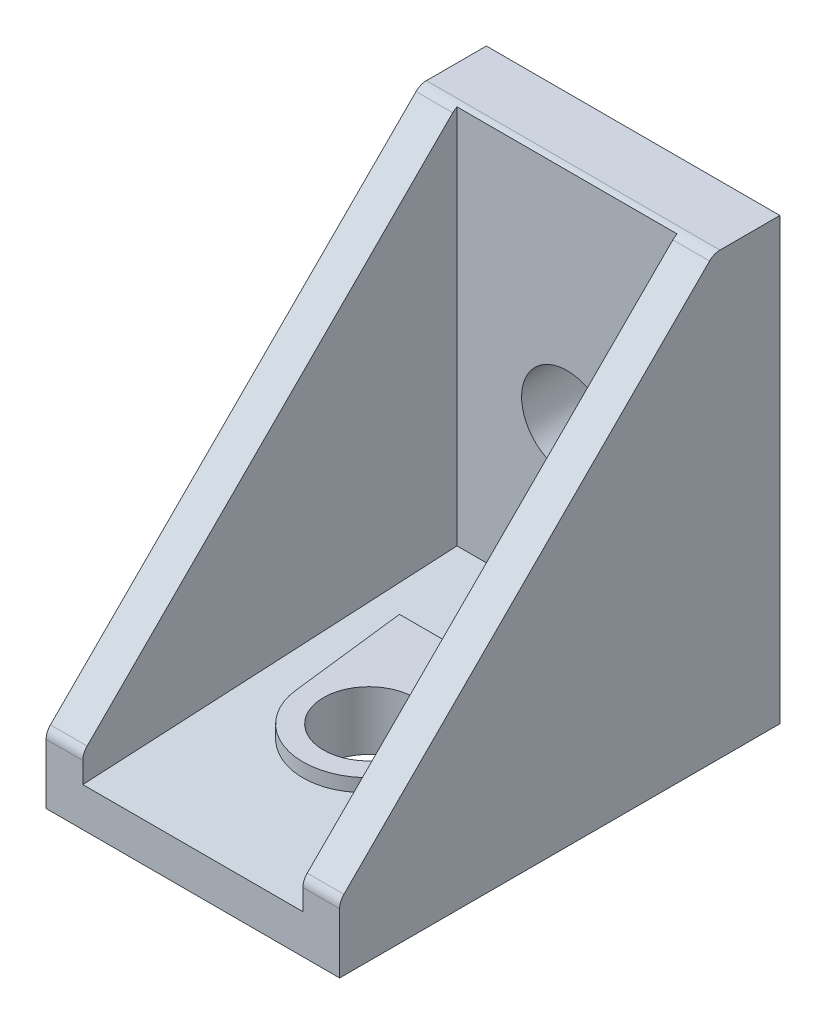
ISO-10303-21;
HEADER;
FILE_DESCRIPTION(('STEP AP214'),'2;1');
FILE_NAME('part.step','',(''),(''),'','','');
FILE_SCHEMA(('AUTOMOTIVE_DESIGN { 1 0 10303 214 1 1 1 1 }'));
ENDSEC;
DATA;
#1=APPLICATION_CONTEXT('core data for automotive mechanical design processes');
#2=APPLICATION_PROTOCOL_DEFINITION('international standard','automotive_design',2000,#1);
#3=PRODUCT_CONTEXT('',#1,'mechanical');
#4=PRODUCT('Part','Part','',(#3));
#5=PRODUCT_RELATED_PRODUCT_CATEGORY('part','',(#4));
#6=PRODUCT_DEFINITION_FORMATION('','',#4);
#7=PRODUCT_DEFINITION_CONTEXT('part definition',#1,'design');
#8=PRODUCT_DEFINITION('design','',#6,#7);
#9=PRODUCT_DEFINITION_SHAPE('','',#8);
#10=(LENGTH_UNIT() NAMED_UNIT(*) SI_UNIT(.MILLI.,.METRE.));
#11=(NAMED_UNIT(*) PLANE_ANGLE_UNIT() SI_UNIT($,.RADIAN.));
#12=(NAMED_UNIT(*) SI_UNIT($,.STERADIAN.) SOLID_ANGLE_UNIT());
#13=UNCERTAINTY_MEASURE_WITH_UNIT(LENGTH_MEASURE(1.E-05),#10,'distance_accuracy_value','');
#14=(GEOMETRIC_REPRESENTATION_CONTEXT(3) GLOBAL_UNCERTAINTY_ASSIGNED_CONTEXT((#13)) GLOBAL_UNIT_ASSIGNED_CONTEXT((#10,
#11,#12)) REPRESENTATION_CONTEXT('',''));
#15=CARTESIAN_POINT('',(0.,0.,0.));
#16=DIRECTION('',(0.,0.,1.));
#17=DIRECTION('',(1.,0.,0.));
#18=AXIS2_PLACEMENT_3D('',#15,#16,#17);
#19=CARTESIAN_POINT('',(5.42088420677179,2.25,10.5));
#20=DIRECTION('',(0.,0.,-1.));
#21=DIRECTION('',(-1.,0.,0.));
#22=AXIS2_PLACEMENT_3D('',#19,#20,#21);
#23=PLANE('',#22);
#24=DIRECTION('',(0.,1.,0.));
#25=VECTOR('',#24,1.);
#26=CARTESIAN_POINT('',(-5.42088420677178,2.25,10.5));
#27=LINE('',#26,#25);
#28=CARTESIAN_POINT('',(-5.42088420677178,3.68555332430175,10.5));
#29=VERTEX_POINT('',#28);
#30=CARTESIAN_POINT('',(-5.42088420677178,4.,10.5));
#31=VERTEX_POINT('',#30);
#32=EDGE_CURVE('E247',#29,#31,#27,.T.);
#33=ORIENTED_EDGE('',*,*,#32,.T.);
#34=DIRECTION('',(-1.,0.,0.));
#35=VECTOR('',#34,1.);
#36=CARTESIAN_POINT('',(5.42088420677179,4.,10.5));
#37=LINE('',#36,#35);
#38=CARTESIAN_POINT('',(5.42088420677179,4.,10.5));
#39=VERTEX_POINT('',#38);
#40=EDGE_CURVE('E232',#39,#31,#37,.T.);
#41=ORIENTED_EDGE('',*,*,#40,.F.);
#42=DIRECTION('',(0.,1.,0.));
#43=VECTOR('',#42,1.);
#44=CARTESIAN_POINT('',(5.42088420677179,2.25,10.5));
#45=LINE('',#44,#43);
#46=CARTESIAN_POINT('',(5.42088420677178,3.68555332430175,10.5));
#47=VERTEX_POINT('',#46);
#48=EDGE_CURVE('E350',#47,#39,#45,.T.);
#49=ORIENTED_EDGE('',*,*,#48,.F.);
#50=DIRECTION('',(-1.,0.,0.));
#51=VECTOR('',#50,1.);
#52=CARTESIAN_POINT('',(7.5,3.68555332430175,10.5));
#53=LINE('',#52,#51);
#54=EDGE_CURVE('E11',#47,#29,#53,.T.);
#55=ORIENTED_EDGE('',*,*,#54,.T.);
#56=EDGE_LOOP('',(#33,#41,#49,#55));
#57=FACE_BOUND('',#56,.T.);
#58=ADVANCED_FACE('F16',(#57),#23,.T.);
#59=CARTESIAN_POINT('',(-5.42088420677178,2.25,10.5));
#60=DIRECTION('',(-0.993042577793247,0.,0.11775584354818));
#61=DIRECTION('',(0.11775584354818,0.,0.993042577793247));
#62=AXIS2_PLACEMENT_3D('',#59,#60,#61);
#63=PLANE('',#62);
#64=DIRECTION('',(0.,1.,0.));
#65=VECTOR('',#64,1.);
#66=CARTESIAN_POINT('',(-4.46869160006961,2.25,18.5299012959668));
#67=LINE('',#66,#65);
#68=CARTESIAN_POINT('',(-4.46869160006961,3.26472402951812,18.5299012959668));
#69=VERTEX_POINT('',#68);
#70=CARTESIAN_POINT('',(-4.46869160006961,4.,18.5299012959668));
#71=VERTEX_POINT('',#70);
#72=EDGE_CURVE('E249',#69,#71,#67,.T.);
#73=ORIENTED_EDGE('',*,*,#72,.T.);
#74=DIRECTION('',(0.11775584354818,0.,0.993042577793247));
#75=VECTOR('',#74,1.);
#76=CARTESIAN_POINT('',(-5.42088420677178,4.,10.5));
#77=LINE('',#76,#75);
#78=EDGE_CURVE('E235',#31,#71,#77,.T.);
#79=ORIENTED_EDGE('',*,*,#78,.F.);
#80=ORIENTED_EDGE('',*,*,#32,.F.);
#81=DIRECTION('',(0.117596696492601,-0.0519728198954029,0.991700480470866));
#82=VECTOR('',#81,1.);
#83=CARTESIAN_POINT('',(-2.43561732754418,2.36619025985062,35.6749469735321));
#84=LINE('',#83,#82);
#85=EDGE_CURVE('E25',#29,#69,#84,.T.);
#86=ORIENTED_EDGE('',*,*,#85,.T.);
#87=EDGE_LOOP('',(#73,#79,#80,#86));
#88=FACE_BOUND('',#87,.T.);
#89=ADVANCED_FACE('F245',(#88),#63,.T.);
#90=CARTESIAN_POINT('',(0.,2.25,18.));
#91=DIRECTION('',(0.,1.,0.));
#92=DIRECTION('',(0.,0.,1.));
#93=AXIS2_PLACEMENT_3D('',#90,#91,#92);
#94=CYLINDRICAL_SURFACE('',#93,4.5);
#95=DIRECTION('',(0.,1.,0.));
#96=VECTOR('',#95,1.);
#97=CARTESIAN_POINT('',(4.46869160006961,2.25,18.5299012959668));
#98=LINE('',#97,#96);
#99=CARTESIAN_POINT('',(4.46869160006961,3.26472402951812,18.5299012959668));
#100=VERTEX_POINT('',#99);
#101=CARTESIAN_POINT('',(4.46869160006961,4.,18.5299012959668));
#102=VERTEX_POINT('',#101);
#103=EDGE_CURVE('E255',#100,#102,#98,.T.);
#104=ORIENTED_EDGE('',*,*,#103,.T.);
#105=CARTESIAN_POINT('',(0.,4.,18.));
#106=DIRECTION('',(0.,1.,0.));
#107=DIRECTION('',(1.,0.,0.));
#108=AXIS2_PLACEMENT_3D('',#105,#106,#107);
#109=CIRCLE('',#108,4.5);
#110=EDGE_CURVE('E33',#71,#102,#109,.T.);
#111=ORIENTED_EDGE('',*,*,#110,.F.);
#112=ORIENTED_EDGE('',*,*,#72,.F.);
#113=CARTESIAN_POINT('',(0.,3.29249497967895,18.));
#114=DIRECTION('',(0.,0.998629534754574,0.0523359562429436));
#115=DIRECTION('',(0.,0.0523359562429436,-0.998629534754574));
#116=AXIS2_PLACEMENT_3D('',#113,#114,#115);
#117=ELLIPSE('',#116,4.50617555699064,4.5);
#118=EDGE_CURVE('E345',#69,#100,#117,.T.);
#119=ORIENTED_EDGE('',*,*,#118,.T.);
#120=EDGE_LOOP('',(#104,#111,#112,#119));
#121=FACE_BOUND('',#120,.T.);
#122=ADVANCED_FACE('F366',(#121),#94,.T.);
#123=CARTESIAN_POINT('',(4.46869160006961,2.25,18.5299012959668));
#124=DIRECTION('',(0.993042577793247,0.,0.11775584354818));
#125=DIRECTION('',(0.11775584354818,0.,-0.993042577793247));
#126=AXIS2_PLACEMENT_3D('',#123,#124,#125);
#127=PLANE('',#126);
#128=ORIENTED_EDGE('',*,*,#48,.T.);
#129=DIRECTION('',(0.11775584354818,0.,-0.993042577793247));
#130=VECTOR('',#129,1.);
#131=CARTESIAN_POINT('',(4.46869160006961,4.,18.5299012959668));
#132=LINE('',#131,#130);
#133=EDGE_CURVE('E236',#102,#39,#132,.T.);
#134=ORIENTED_EDGE('',*,*,#133,.F.);
#135=ORIENTED_EDGE('',*,*,#103,.F.);
#136=DIRECTION('',(0.117596696492601,0.0519728198954029,-0.991700480470866));
#137=VECTOR('',#136,1.);
#138=CARTESIAN_POINT('',(2.64305207293378,2.45786773875719,33.9256364673296));
#139=LINE('',#138,#137);
#140=EDGE_CURVE('E342',#100,#47,#139,.T.);
#141=ORIENTED_EDGE('',*,*,#140,.T.);
#142=EDGE_LOOP('',(#128,#134,#135,#141));
#143=FACE_BOUND('',#142,.T.);
#144=ADVANCED_FACE('F368',(#143),#127,.T.);
#145=CARTESIAN_POINT('',(0.,4.5,18.));
#146=DIRECTION('',(0.,-1.,0.));
#147=DIRECTION('',(0.,0.,-1.));
#148=AXIS2_PLACEMENT_3D('',#145,#146,#147);
#149=CYLINDRICAL_SURFACE('',#148,3.1);
#150=CARTESIAN_POINT('',(0.,0.,18.));
#151=DIRECTION('',(0.,1.,0.));
#152=DIRECTION('',(1.,0.,0.));
#153=AXIS2_PLACEMENT_3D('',#150,#151,#152);
#154=CIRCLE('',#153,3.1);
#155=CARTESIAN_POINT('',(3.1,0.,18.));
#156=VERTEX_POINT('',#155);
#157=EDGE_CURVE('E360',#156,#156,#154,.T.);
#158=ORIENTED_EDGE('',*,*,#157,.F.);
#159=EDGE_LOOP('',(#158));
#160=FACE_BOUND('',#159,.T.);
#161=CARTESIAN_POINT('',(0.,4.,18.));
#162=DIRECTION('',(0.,1.,0.));
#163=DIRECTION('',(0.,0.,1.));
#164=AXIS2_PLACEMENT_3D('',#161,#162,#163);
#165=CIRCLE('',#164,3.1);
#166=CARTESIAN_POINT('',(0.,4.,21.1));
#167=VERTEX_POINT('',#166);
#168=EDGE_CURVE('E20',#167,#167,#165,.T.);
#169=ORIENTED_EDGE('',*,*,#168,.T.);
#170=EDGE_LOOP('',(#169));
#171=FACE_BOUND('',#170,.T.);
#172=ADVANCED_FACE('F513',(#160,#171),#149,.F.);
#173=CARTESIAN_POINT('',(10.,29.7071067811866,4.79289321881346));
#174=DIRECTION('',(0.,-0.707106781186547,-0.707106781186548));
#175=DIRECTION('',(0.,0.707106781186548,-0.707106781186547));
#176=AXIS2_PLACEMENT_3D('',#173,#174,#175);
#177=PLANE('',#176);
#178=DIRECTION('',(0.,-0.707106781186548,0.707106781186547));
#179=VECTOR('',#178,1.);
#180=CARTESIAN_POINT('',(-7.5,29.7071067811866,4.79289321881346));
#181=LINE('',#180,#179);
#182=CARTESIAN_POINT('',(-7.5,29.7071067811866,4.79289321881346));
#183=VERTEX_POINT('',#182);
#184=CARTESIAN_POINT('',(-7.5,4.79289321881346,29.7071067811865));
#185=VERTEX_POINT('',#184);
#186=EDGE_CURVE('E332',#183,#185,#181,.T.);
#187=ORIENTED_EDGE('',*,*,#186,.F.);
#188=DIRECTION('',(-1.,0.,0.));
#189=VECTOR('',#188,1.);
#190=CARTESIAN_POINT('',(10.,29.7071067811866,4.79289321881346));
#191=LINE('',#190,#189);
#192=CARTESIAN_POINT('',(-10.,29.7071067811866,4.79289321881346));
#193=VERTEX_POINT('',#192);
#194=EDGE_CURVE('E318',#183,#193,#191,.T.);
#195=ORIENTED_EDGE('',*,*,#194,.T.);
#196=DIRECTION('',(0.,-0.707106781186548,0.707106781186547));
#197=VECTOR('',#196,1.);
#198=CARTESIAN_POINT('',(-10.,29.7071067811866,4.79289321881346));
#199=LINE('',#198,#197);
#200=CARTESIAN_POINT('',(-10.,4.79289321881346,29.7071067811865));
#201=VERTEX_POINT('',#200);
#202=EDGE_CURVE('E289',#193,#201,#199,.T.);
#203=ORIENTED_EDGE('',*,*,#202,.T.);
#204=DIRECTION('',(-1.,0.,0.));
#205=VECTOR('',#204,1.);
#206=CARTESIAN_POINT('',(10.,4.79289321881346,29.7071067811865));
#207=LINE('',#206,#205);
#208=EDGE_CURVE('E300',#185,#201,#207,.T.);
#209=ORIENTED_EDGE('',*,*,#208,.F.);
#210=EDGE_LOOP('',(#187,#195,#203,#209));
#211=FACE_BOUND('',#210,.T.);
#212=ADVANCED_FACE('F516',(#211),#177,.F.);
#213=CARTESIAN_POINT('',(10.,4.08578643762691,29.));
#214=DIRECTION('',(-1.,0.,0.));
#215=DIRECTION('',(0.,0.,1.));
#216=AXIS2_PLACEMENT_3D('',#213,#214,#215);
#217=CYLINDRICAL_SURFACE('',#216,0.99999999999999);
#218=CARTESIAN_POINT('',(-7.5,4.08578643762691,29.));
#219=DIRECTION('',(1.,0.,0.));
#220=DIRECTION('',(0.,0.,-1.));
#221=AXIS2_PLACEMENT_3D('',#218,#219,#220);
#222=CIRCLE('',#221,0.99999999999999);
#223=CARTESIAN_POINT('',(-7.5,4.08578643762692,30.));
#224=VERTEX_POINT('',#223);
#225=EDGE_CURVE('E275',#185,#224,#222,.T.);
#226=ORIENTED_EDGE('',*,*,#225,.F.);
#227=ORIENTED_EDGE('',*,*,#208,.T.);
#228=CARTESIAN_POINT('',(-10.,4.08578643762691,29.));
#229=DIRECTION('',(1.,0.,0.));
#230=DIRECTION('',(0.,0.,-1.));
#231=AXIS2_PLACEMENT_3D('',#228,#229,#230);
#232=CIRCLE('',#231,0.99999999999999);
#233=CARTESIAN_POINT('',(-10.,4.08578643762692,30.));
#234=VERTEX_POINT('',#233);
#235=EDGE_CURVE('E284',#201,#234,#232,.T.);
#236=ORIENTED_EDGE('',*,*,#235,.T.);
#237=DIRECTION('',(-1.,0.,0.));
#238=VECTOR('',#237,1.);
#239=CARTESIAN_POINT('',(10.,4.08578643762692,30.));
#240=LINE('',#239,#238);
#241=EDGE_CURVE('E328',#224,#234,#240,.T.);
#242=ORIENTED_EDGE('',*,*,#241,.F.);
#243=EDGE_LOOP('',(#226,#227,#236,#242));
#244=FACE_BOUND('',#243,.T.);
#245=ADVANCED_FACE('F582',(#244),#217,.T.);
#246=CARTESIAN_POINT('',(10.,4.79289321881346,29.7071067811865));
#247=VERTEX_POINT('',#246);
#248=CARTESIAN_POINT('',(7.5,4.79289321881346,29.7071067811865));
#249=VERTEX_POINT('',#248);
#250=EDGE_CURVE('E315',#247,#249,#207,.T.);
#251=ORIENTED_EDGE('',*,*,#250,.T.);
#252=CARTESIAN_POINT('',(7.5,4.08578643762691,29.));
#253=DIRECTION('',(1.,0.,0.));
#254=DIRECTION('',(0.,0.,-1.));
#255=AXIS2_PLACEMENT_3D('',#252,#253,#254);
#256=CIRCLE('',#255,0.99999999999999);
#257=CARTESIAN_POINT('',(7.5,4.08578643762692,30.));
#258=VERTEX_POINT('',#257);
#259=EDGE_CURVE('E279',#249,#258,#256,.T.);
#260=ORIENTED_EDGE('',*,*,#259,.T.);
#261=CARTESIAN_POINT('',(10.,4.08578643762692,30.));
#262=VERTEX_POINT('',#261);
#263=EDGE_CURVE('E329',#262,#258,#240,.T.);
#264=ORIENTED_EDGE('',*,*,#263,.F.);
#265=CARTESIAN_POINT('',(10.,4.08578643762691,29.));
#266=DIRECTION('',(1.,0.,0.));
#267=DIRECTION('',(0.,0.,-1.));
#268=AXIS2_PLACEMENT_3D('',#265,#266,#267);
#269=CIRCLE('',#268,0.99999999999999);
#270=EDGE_CURVE('E285',#247,#262,#269,.T.);
#271=ORIENTED_EDGE('',*,*,#270,.F.);
#272=EDGE_LOOP('',(#251,#260,#264,#271));
#273=FACE_BOUND('',#272,.T.);
#274=ADVANCED_FACE('F18',(#273),#217,.T.);
#275=CARTESIAN_POINT('',(10.,4.08578643762692,30.));
#276=DIRECTION('',(0.,0.,-1.));
#277=DIRECTION('',(-1.,0.,0.));
#278=AXIS2_PLACEMENT_3D('',#275,#276,#277);
#279=PLANE('',#278);
#280=DIRECTION('',(0.,-1.,0.));
#281=VECTOR('',#280,1.);
#282=CARTESIAN_POINT('',(-10.,4.08578643762692,30.));
#283=LINE('',#282,#281);
#284=CARTESIAN_POINT('',(-10.,0.,30.));
#285=VERTEX_POINT('',#284);
#286=EDGE_CURVE('E303',#234,#285,#283,.T.);
#287=ORIENTED_EDGE('',*,*,#286,.T.);
#288=DIRECTION('',(1.,0.,0.));
#289=VECTOR('',#288,1.);
#290=CARTESIAN_POINT('',(-10.,0.,30.));
#291=LINE('',#290,#289);
#292=CARTESIAN_POINT('',(10.,0.,30.));
#293=VERTEX_POINT('',#292);
#294=EDGE_CURVE('E497',#285,#293,#291,.T.);
#295=ORIENTED_EDGE('',*,*,#294,.T.);
#296=DIRECTION('',(0.,-1.,0.));
#297=VECTOR('',#296,1.);
#298=CARTESIAN_POINT('',(10.,4.08578643762692,30.));
#299=LINE('',#298,#297);
#300=EDGE_CURVE('E288',#262,#293,#299,.T.);
#301=ORIENTED_EDGE('',*,*,#300,.F.);
#302=ORIENTED_EDGE('',*,*,#263,.T.);
#303=DIRECTION('',(0.,-1.,0.));
#304=VECTOR('',#303,1.);
#305=CARTESIAN_POINT('',(7.5,4.08578643762692,30.));
#306=LINE('',#305,#304);
#307=CARTESIAN_POINT('',(7.5,2.66360162828245,30.));
#308=VERTEX_POINT('',#307);
#309=EDGE_CURVE('E282',#258,#308,#306,.T.);
#310=ORIENTED_EDGE('',*,*,#309,.T.);
#311=DIRECTION('',(1.,0.,0.));
#312=VECTOR('',#311,1.);
#313=CARTESIAN_POINT('',(10.,2.66360162828245,30.));
#314=LINE('',#313,#312);
#315=CARTESIAN_POINT('',(-7.5,2.66360162828245,30.));
#316=VERTEX_POINT('',#315);
#317=EDGE_CURVE('E339',#316,#308,#314,.T.);
#318=ORIENTED_EDGE('',*,*,#317,.F.);
#319=DIRECTION('',(0.,-1.,0.));
#320=VECTOR('',#319,1.);
#321=CARTESIAN_POINT('',(-7.5,4.08578643762692,30.));
#322=LINE('',#321,#320);
#323=EDGE_CURVE('E277',#224,#316,#322,.T.);
#324=ORIENTED_EDGE('',*,*,#323,.F.);
#325=ORIENTED_EDGE('',*,*,#241,.T.);
#326=EDGE_LOOP('',(#287,#295,#301,#302,#310,#318,#324,#325));
#327=FACE_BOUND('',#326,.T.);
#328=ADVANCED_FACE('F576',(#327),#279,.F.);
#329=CARTESIAN_POINT('',(10.,0.,0.));
#330=DIRECTION('',(0.,0.,1.));
#331=DIRECTION('',(1.,0.,0.));
#332=AXIS2_PLACEMENT_3D('',#329,#330,#331);
#333=PLANE('',#332);
#334=DIRECTION('',(0.,-1.,0.));
#335=VECTOR('',#334,1.);
#336=CARTESIAN_POINT('',(-3.6,18.4,0.));
#337=LINE('',#336,#335);
#338=CARTESIAN_POINT('',(-3.6,18.4,0.));
#339=VERTEX_POINT('',#338);
#340=CARTESIAN_POINT('',(-3.6,15.5,0.));
#341=VERTEX_POINT('',#340);
#342=EDGE_CURVE('E41',#339,#341,#337,.T.);
#343=ORIENTED_EDGE('',*,*,#342,.T.);
#344=DIRECTION('',(1.,0.,0.));
#345=VECTOR('',#344,1.);
#346=CARTESIAN_POINT('',(-3.6,15.5,0.));
#347=LINE('',#346,#345);
#348=CARTESIAN_POINT('',(-3.05941170815567,15.5,0.));
#349=VERTEX_POINT('',#348);
#350=EDGE_CURVE('E402',#341,#349,#347,.T.);
#351=ORIENTED_EDGE('',*,*,#350,.T.);
#352=CARTESIAN_POINT('',(0.,15.,0.));
#353=DIRECTION('',(0.,0.,1.));
#354=DIRECTION('',(1.,0.,0.));
#355=AXIS2_PLACEMENT_3D('',#352,#353,#354);
#356=CIRCLE('',#355,3.1);
#357=CARTESIAN_POINT('',(-3.05941170815567,14.5,0.));
#358=VERTEX_POINT('',#357);
#359=EDGE_CURVE('E355',#349,#358,#356,.T.);
#360=ORIENTED_EDGE('',*,*,#359,.T.);
#361=DIRECTION('',(-1.,0.,0.));
#362=VECTOR('',#361,1.);
#363=CARTESIAN_POINT('',(-3.05941170815567,14.5,0.));
#364=LINE('',#363,#362);
#365=CARTESIAN_POINT('',(-3.6,14.5,0.));
#366=VERTEX_POINT('',#365);
#367=EDGE_CURVE('E437',#358,#366,#364,.T.);
#368=ORIENTED_EDGE('',*,*,#367,.T.);
#369=DIRECTION('',(0.,-1.,0.));
#370=VECTOR('',#369,1.);
#371=CARTESIAN_POINT('',(-3.6,14.5,0.));
#372=LINE('',#371,#370);
#373=CARTESIAN_POINT('',(-3.6,11.6,0.));
#374=VERTEX_POINT('',#373);
#375=EDGE_CURVE('E432',#366,#374,#372,.T.);
#376=ORIENTED_EDGE('',*,*,#375,.T.);
#377=CARTESIAN_POINT('',(-3.4,11.6,0.));
#378=DIRECTION('',(0.,0.,1.));
#379=DIRECTION('',(1.,0.,0.));
#380=AXIS2_PLACEMENT_3D('',#377,#378,#379);
#381=CIRCLE('',#380,0.200000000000001);
#382=CARTESIAN_POINT('',(-3.4,11.4,0.));
#383=VERTEX_POINT('',#382);
#384=EDGE_CURVE('E461',#374,#383,#381,.T.);
#385=ORIENTED_EDGE('',*,*,#384,.T.);
#386=DIRECTION('',(1.,0.,0.));
#387=VECTOR('',#386,1.);
#388=CARTESIAN_POINT('',(-3.4,11.4,0.));
#389=LINE('',#388,#387);
#390=CARTESIAN_POINT('',(3.4,11.4,0.));
#391=VERTEX_POINT('',#390);
#392=EDGE_CURVE('E464',#383,#391,#389,.T.);
#393=ORIENTED_EDGE('',*,*,#392,.T.);
#394=CARTESIAN_POINT('',(3.4,11.6,0.));
#395=DIRECTION('',(0.,0.,1.));
#396=DIRECTION('',(1.,0.,0.));
#397=AXIS2_PLACEMENT_3D('',#394,#395,#396);
#398=CIRCLE('',#397,0.200000000000002);
#399=CARTESIAN_POINT('',(3.6,11.6,0.));
#400=VERTEX_POINT('',#399);
#401=EDGE_CURVE('E467',#391,#400,#398,.T.);
#402=ORIENTED_EDGE('',*,*,#401,.T.);
#403=DIRECTION('',(0.,1.,0.));
#404=VECTOR('',#403,1.);
#405=CARTESIAN_POINT('',(3.6,11.6,0.));
#406=LINE('',#405,#404);
#407=CARTESIAN_POINT('',(3.6,14.5,0.));
#408=VERTEX_POINT('',#407);
#409=EDGE_CURVE('E470',#400,#408,#406,.T.);
#410=ORIENTED_EDGE('',*,*,#409,.T.);
#411=DIRECTION('',(-1.,0.,0.));
#412=VECTOR('',#411,1.);
#413=CARTESIAN_POINT('',(3.6,14.5,0.));
#414=LINE('',#413,#412);
#415=CARTESIAN_POINT('',(3.05941170815567,14.5,0.));
#416=VERTEX_POINT('',#415);
#417=EDGE_CURVE('E473',#408,#416,#414,.T.);
#418=ORIENTED_EDGE('',*,*,#417,.T.);
#419=CARTESIAN_POINT('',(3.05941170815567,15.5,0.));
#420=VERTEX_POINT('',#419);
#421=EDGE_CURVE('E351',#416,#420,#356,.T.);
#422=ORIENTED_EDGE('',*,*,#421,.T.);
#423=DIRECTION('',(1.,0.,0.));
#424=VECTOR('',#423,1.);
#425=CARTESIAN_POINT('',(3.05941170815567,15.5,0.));
#426=LINE('',#425,#424);
#427=CARTESIAN_POINT('',(3.6,15.5,0.));
#428=VERTEX_POINT('',#427);
#429=EDGE_CURVE('E404',#420,#428,#426,.T.);
#430=ORIENTED_EDGE('',*,*,#429,.T.);
#431=DIRECTION('',(0.,1.,0.));
#432=VECTOR('',#431,1.);
#433=CARTESIAN_POINT('',(3.6,15.5,0.));
#434=LINE('',#433,#432);
#435=CARTESIAN_POINT('',(3.6,18.4,0.));
#436=VERTEX_POINT('',#435);
#437=EDGE_CURVE('E406',#428,#436,#434,.T.);
#438=ORIENTED_EDGE('',*,*,#437,.T.);
#439=CARTESIAN_POINT('',(3.4,18.4,0.));
#440=DIRECTION('',(0.,0.,1.));
#441=DIRECTION('',(1.,0.,0.));
#442=AXIS2_PLACEMENT_3D('',#439,#440,#441);
#443=CIRCLE('',#442,0.200000000000003);
#444=CARTESIAN_POINT('',(3.4,18.6,0.));
#445=VERTEX_POINT('',#444);
#446=EDGE_CURVE('E408',#436,#445,#443,.T.);
#447=ORIENTED_EDGE('',*,*,#446,.T.);
#448=DIRECTION('',(-1.,0.,0.));
#449=VECTOR('',#448,1.);
#450=CARTESIAN_POINT('',(3.4,18.6,0.));
#451=LINE('',#450,#449);
#452=CARTESIAN_POINT('',(-3.4,18.6,0.));
#453=VERTEX_POINT('',#452);
#454=EDGE_CURVE('E378',#445,#453,#451,.T.);
#455=ORIENTED_EDGE('',*,*,#454,.T.);
#456=CARTESIAN_POINT('',(-3.39999999999999,18.4,0.));
#457=DIRECTION('',(0.,0.,1.));
#458=DIRECTION('',(1.,0.,0.));
#459=AXIS2_PLACEMENT_3D('',#456,#457,#458);
#460=CIRCLE('',#459,0.200000000000006);
#461=EDGE_CURVE('E371',#453,#339,#460,.T.);
#462=ORIENTED_EDGE('',*,*,#461,.T.);
#463=EDGE_LOOP('',(#343,#351,#360,#368,#376,#385,#393,#402,#410,#418,#422,#430,#438,#447,#455,#462));
#464=FACE_BOUND('',#463,.T.);
#465=DIRECTION('',(0.,1.,0.));
#466=VECTOR('',#465,1.);
#467=CARTESIAN_POINT('',(10.,0.,0.));
#468=LINE('',#467,#466);
#469=CARTESIAN_POINT('',(10.,0.,0.));
#470=VERTEX_POINT('',#469);
#471=CARTESIAN_POINT('',(10.,30.,0.));
#472=VERTEX_POINT('',#471);
#473=EDGE_CURVE('E292',#470,#472,#468,.T.);
#474=ORIENTED_EDGE('',*,*,#473,.F.);
#475=DIRECTION('',(-1.,0.,0.));
#476=VECTOR('',#475,1.);
#477=CARTESIAN_POINT('',(10.,0.,0.));
#478=LINE('',#477,#476);
#479=CARTESIAN_POINT('',(-10.,0.,0.));
#480=VERTEX_POINT('',#479);
#481=EDGE_CURVE('E502',#470,#480,#478,.T.);
#482=ORIENTED_EDGE('',*,*,#481,.T.);
#483=DIRECTION('',(0.,1.,0.));
#484=VECTOR('',#483,1.);
#485=CARTESIAN_POINT('',(-10.,0.,0.));
#486=LINE('',#485,#484);
#487=CARTESIAN_POINT('',(-10.,30.,0.));
#488=VERTEX_POINT('',#487);
#489=EDGE_CURVE('E306',#480,#488,#486,.T.);
#490=ORIENTED_EDGE('',*,*,#489,.T.);
#491=DIRECTION('',(-1.,0.,0.));
#492=VECTOR('',#491,1.);
#493=CARTESIAN_POINT('',(10.,30.,0.));
#494=LINE('',#493,#492);
#495=EDGE_CURVE('E325',#472,#488,#494,.T.);
#496=ORIENTED_EDGE('',*,*,#495,.F.);
#497=EDGE_LOOP('',(#474,#482,#490,#496));
#498=FACE_BOUND('',#497,.T.);
#499=ADVANCED_FACE('F573',(#464,#498),#333,.F.);
#500=CARTESIAN_POINT('',(10.,30.,0.));
#501=DIRECTION('',(0.,-1.,0.));
#502=DIRECTION('',(0.,0.,-1.));
#503=AXIS2_PLACEMENT_3D('',#500,#501,#502);
#504=PLANE('',#503);
#505=DIRECTION('',(0.,0.,1.));
#506=VECTOR('',#505,1.);
#507=CARTESIAN_POINT('',(-10.,30.,0.));
#508=LINE('',#507,#506);
#509=CARTESIAN_POINT('',(-10.,30.,4.08578643762691));
#510=VERTEX_POINT('',#509);
#511=EDGE_CURVE('E308',#488,#510,#508,.T.);
#512=ORIENTED_EDGE('',*,*,#511,.T.);
#513=DIRECTION('',(-1.,0.,0.));
#514=VECTOR('',#513,1.);
#515=CARTESIAN_POINT('',(10.,30.,4.08578643762691));
#516=LINE('',#515,#514);
#517=CARTESIAN_POINT('',(10.,30.,4.08578643762691));
#518=VERTEX_POINT('',#517);
#519=EDGE_CURVE('E322',#518,#510,#516,.T.);
#520=ORIENTED_EDGE('',*,*,#519,.F.);
#521=DIRECTION('',(0.,0.,1.));
#522=VECTOR('',#521,1.);
#523=CARTESIAN_POINT('',(10.,30.,0.));
#524=LINE('',#523,#522);
#525=EDGE_CURVE('E294',#472,#518,#524,.T.);
#526=ORIENTED_EDGE('',*,*,#525,.F.);
#527=ORIENTED_EDGE('',*,*,#495,.T.);
#528=EDGE_LOOP('',(#512,#520,#526,#527));
#529=FACE_BOUND('',#528,.T.);
#530=ADVANCED_FACE('F569',(#529),#504,.F.);
#531=CARTESIAN_POINT('',(10.,29.,4.08578643762693));
#532=DIRECTION('',(-1.,0.,0.));
#533=DIRECTION('',(0.,0.,1.));
#534=AXIS2_PLACEMENT_3D('',#531,#532,#533);
#535=CYLINDRICAL_SURFACE('',#534,0.999999999999984);
#536=DIRECTION('',(-1.,0.,0.));
#537=VECTOR('',#536,1.);
#538=CARTESIAN_POINT('',(10.,29.9101797211245,4.5));
#539=LINE('',#538,#537);
#540=CARTESIAN_POINT('',(7.5,29.9101797211245,4.5));
#541=VERTEX_POINT('',#540);
#542=CARTESIAN_POINT('',(-7.5,29.9101797211245,4.5));
#543=VERTEX_POINT('',#542);
#544=EDGE_CURVE('E337',#541,#543,#539,.T.);
#545=ORIENTED_EDGE('',*,*,#544,.F.);
#546=CARTESIAN_POINT('',(7.5,29.,4.08578643762693));
#547=DIRECTION('',(1.,0.,0.));
#548=DIRECTION('',(0.,0.,-1.));
#549=AXIS2_PLACEMENT_3D('',#546,#547,#548);
#550=CIRCLE('',#549,0.999999999999984);
#551=CARTESIAN_POINT('',(7.5,29.7071067811866,4.79289321881346));
#552=VERTEX_POINT('',#551);
#553=EDGE_CURVE('E272',#541,#552,#550,.T.);
#554=ORIENTED_EDGE('',*,*,#553,.T.);
#555=CARTESIAN_POINT('',(10.,29.7071067811866,4.79289321881346));
#556=VERTEX_POINT('',#555);
#557=EDGE_CURVE('E319',#556,#552,#191,.T.);
#558=ORIENTED_EDGE('',*,*,#557,.F.);
#559=CARTESIAN_POINT('',(10.,29.,4.08578643762693));
#560=DIRECTION('',(1.,0.,0.));
#561=DIRECTION('',(0.,0.,-1.));
#562=AXIS2_PLACEMENT_3D('',#559,#560,#561);
#563=CIRCLE('',#562,0.999999999999984);
#564=EDGE_CURVE('E296',#518,#556,#563,.T.);
#565=ORIENTED_EDGE('',*,*,#564,.F.);
#566=ORIENTED_EDGE('',*,*,#519,.T.);
#567=CARTESIAN_POINT('',(-10.,29.,4.08578643762693));
#568=DIRECTION('',(1.,0.,0.));
#569=DIRECTION('',(0.,0.,-1.));
#570=AXIS2_PLACEMENT_3D('',#567,#568,#569);
#571=CIRCLE('',#570,0.999999999999984);
#572=EDGE_CURVE('E310',#510,#193,#571,.T.);
#573=ORIENTED_EDGE('',*,*,#572,.T.);
#574=ORIENTED_EDGE('',*,*,#194,.F.);
#575=CARTESIAN_POINT('',(-7.5,29.,4.08578643762693));
#576=DIRECTION('',(1.,0.,0.));
#577=DIRECTION('',(0.,0.,-1.));
#578=AXIS2_PLACEMENT_3D('',#575,#576,#577);
#579=CIRCLE('',#578,0.999999999999984);
#580=EDGE_CURVE('E269',#543,#183,#579,.T.);
#581=ORIENTED_EDGE('',*,*,#580,.F.);
#582=EDGE_LOOP('',(#545,#554,#558,#565,#566,#573,#574,#581));
#583=FACE_BOUND('',#582,.T.);
#584=ADVANCED_FACE('F565',(#583),#535,.T.);
#585=ORIENTED_EDGE('',*,*,#557,.T.);
#586=DIRECTION('',(0.,-0.707106781186548,0.707106781186547));
#587=VECTOR('',#586,1.);
#588=CARTESIAN_POINT('',(7.5,29.7071067811866,4.79289321881346));
#589=LINE('',#588,#587);
#590=EDGE_CURVE('E334',#552,#249,#589,.T.);
#591=ORIENTED_EDGE('',*,*,#590,.T.);
#592=ORIENTED_EDGE('',*,*,#250,.F.);
#593=DIRECTION('',(0.,-0.707106781186548,0.707106781186547));
#594=VECTOR('',#593,1.);
#595=CARTESIAN_POINT('',(10.,29.7071067811866,4.79289321881346));
#596=LINE('',#595,#594);
#597=EDGE_CURVE('E298',#556,#247,#596,.T.);
#598=ORIENTED_EDGE('',*,*,#597,.F.);
#599=EDGE_LOOP('',(#585,#591,#592,#598));
#600=FACE_BOUND('',#599,.T.);
#601=ADVANCED_FACE('F558',(#600),#177,.F.);
#602=CARTESIAN_POINT('',(10.,4.08578643762691,29.));
#603=DIRECTION('',(1.,0.,0.));
#604=DIRECTION('',(0.,0.,-1.));
#605=AXIS2_PLACEMENT_3D('',#602,#603,#604);
#606=PLANE('',#605);
#607=DIRECTION('',(0.,0.,-1.));
#608=VECTOR('',#607,1.);
#609=CARTESIAN_POINT('',(10.,0.,30.));
#610=LINE('',#609,#608);
#611=EDGE_CURVE('E500',#293,#470,#610,.T.);
#612=ORIENTED_EDGE('',*,*,#611,.T.);
#613=ORIENTED_EDGE('',*,*,#473,.T.);
#614=ORIENTED_EDGE('',*,*,#525,.T.);
#615=ORIENTED_EDGE('',*,*,#564,.T.);
#616=ORIENTED_EDGE('',*,*,#597,.T.);
#617=ORIENTED_EDGE('',*,*,#270,.T.);
#618=ORIENTED_EDGE('',*,*,#300,.T.);
#619=EDGE_LOOP('',(#612,#613,#614,#615,#616,#617,#618));
#620=FACE_BOUND('',#619,.T.);
#621=ADVANCED_FACE('F555',(#620),#606,.T.);
#622=CARTESIAN_POINT('',(-10.,4.08578643762691,29.));
#623=DIRECTION('',(1.,0.,0.));
#624=DIRECTION('',(0.,0.,-1.));
#625=AXIS2_PLACEMENT_3D('',#622,#623,#624);
#626=PLANE('',#625);
#627=ORIENTED_EDGE('',*,*,#489,.F.);
#628=DIRECTION('',(0.,0.,1.));
#629=VECTOR('',#628,1.);
#630=CARTESIAN_POINT('',(-10.,0.,0.));
#631=LINE('',#630,#629);
#632=EDGE_CURVE('E494',#480,#285,#631,.T.);
#633=ORIENTED_EDGE('',*,*,#632,.T.);
#634=ORIENTED_EDGE('',*,*,#286,.F.);
#635=ORIENTED_EDGE('',*,*,#235,.F.);
#636=ORIENTED_EDGE('',*,*,#202,.F.);
#637=ORIENTED_EDGE('',*,*,#572,.F.);
#638=ORIENTED_EDGE('',*,*,#511,.F.);
#639=EDGE_LOOP('',(#627,#633,#634,#635,#636,#637,#638));
#640=FACE_BOUND('',#639,.T.);
#641=ADVANCED_FACE('F550',(#640),#626,.F.);
#642=CARTESIAN_POINT('',(7.5,0.,0.));
#643=DIRECTION('',(1.,0.,0.));
#644=DIRECTION('',(0.,0.,-1.));
#645=AXIS2_PLACEMENT_3D('',#642,#643,#644);
#646=PLANE('',#645);
#647=ORIENTED_EDGE('',*,*,#259,.F.);
#648=ORIENTED_EDGE('',*,*,#590,.F.);
#649=ORIENTED_EDGE('',*,*,#553,.F.);
#650=DIRECTION('',(0.,1.,0.));
#651=VECTOR('',#650,1.);
#652=CARTESIAN_POINT('',(7.5,4.,4.5));
#653=LINE('',#652,#651);
#654=CARTESIAN_POINT('',(7.5,4.,4.5));
#655=VERTEX_POINT('',#654);
#656=EDGE_CURVE('E261',#655,#541,#653,.T.);
#657=ORIENTED_EDGE('',*,*,#656,.F.);
#658=DIRECTION('',(0.,0.0523359562429436,-0.998629534754574));
#659=VECTOR('',#658,1.);
#660=CARTESIAN_POINT('',(7.5,2.42776662150877,34.5));
#661=LINE('',#660,#659);
#662=EDGE_CURVE('E259',#308,#655,#661,.T.);
#663=ORIENTED_EDGE('',*,*,#662,.F.);
#664=ORIENTED_EDGE('',*,*,#309,.F.);
#665=EDGE_LOOP('',(#647,#648,#649,#657,#663,#664));
#666=FACE_BOUND('',#665,.T.);
#667=ADVANCED_FACE('F547',(#666),#646,.F.);
#668=CARTESIAN_POINT('',(-7.5,0.,0.));
#669=DIRECTION('',(1.,0.,0.));
#670=DIRECTION('',(0.,0.,-1.));
#671=AXIS2_PLACEMENT_3D('',#668,#669,#670);
#672=PLANE('',#671);
#673=ORIENTED_EDGE('',*,*,#323,.T.);
#674=DIRECTION('',(0.,0.0523359562429436,-0.998629534754574));
#675=VECTOR('',#674,1.);
#676=CARTESIAN_POINT('',(-7.5,2.42776662150877,34.5));
#677=LINE('',#676,#675);
#678=CARTESIAN_POINT('',(-7.5,4.,4.5));
#679=VERTEX_POINT('',#678);
#680=EDGE_CURVE('E251',#316,#679,#677,.T.);
#681=ORIENTED_EDGE('',*,*,#680,.T.);
#682=DIRECTION('',(0.,1.,0.));
#683=VECTOR('',#682,1.);
#684=CARTESIAN_POINT('',(-7.5,4.,4.5));
#685=LINE('',#684,#683);
#686=EDGE_CURVE('E253',#679,#543,#685,.T.);
#687=ORIENTED_EDGE('',*,*,#686,.T.);
#688=ORIENTED_EDGE('',*,*,#580,.T.);
#689=ORIENTED_EDGE('',*,*,#186,.T.);
#690=ORIENTED_EDGE('',*,*,#225,.T.);
#691=EDGE_LOOP('',(#673,#681,#687,#688,#689,#690));
#692=FACE_BOUND('',#691,.T.);
#693=ADVANCED_FACE('F545',(#692),#672,.T.);
#694=CARTESIAN_POINT('',(7.5,2.42776662150877,34.5));
#695=DIRECTION('',(0.,0.998629534754574,0.0523359562429436));
#696=DIRECTION('',(0.,-0.0523359562429436,0.998629534754574));
#697=AXIS2_PLACEMENT_3D('',#694,#695,#696);
#698=PLANE('',#697);
#699=ORIENTED_EDGE('',*,*,#54,.F.);
#700=ORIENTED_EDGE('',*,*,#140,.F.);
#701=ORIENTED_EDGE('',*,*,#118,.F.);
#702=ORIENTED_EDGE('',*,*,#85,.F.);
#703=EDGE_LOOP('',(#699,#700,#701,#702));
#704=FACE_BOUND('',#703,.T.);
#705=ORIENTED_EDGE('',*,*,#317,.T.);
#706=ORIENTED_EDGE('',*,*,#662,.T.);
#707=DIRECTION('',(-1.,0.,0.));
#708=VECTOR('',#707,1.);
#709=CARTESIAN_POINT('',(7.5,4.,4.5));
#710=LINE('',#709,#708);
#711=EDGE_CURVE('E263',#655,#679,#710,.T.);
#712=ORIENTED_EDGE('',*,*,#711,.T.);
#713=ORIENTED_EDGE('',*,*,#680,.F.);
#714=EDGE_LOOP('',(#705,#706,#712,#713));
#715=FACE_BOUND('',#714,.T.);
#716=ADVANCED_FACE('F542',(#704,#715),#698,.T.);
#717=CARTESIAN_POINT('',(7.5,4.,4.5));
#718=DIRECTION('',(0.,0.,1.));
#719=DIRECTION('',(1.,0.,0.));
#720=AXIS2_PLACEMENT_3D('',#717,#718,#719);
#721=PLANE('',#720);
#722=CARTESIAN_POINT('',(0.,15.,4.5));
#723=DIRECTION('',(0.,0.,1.));
#724=DIRECTION('',(1.,0.,0.));
#725=AXIS2_PLACEMENT_3D('',#722,#723,#724);
#726=CIRCLE('',#725,3.1);
#727=CARTESIAN_POINT('',(3.1,15.,4.5));
#728=VERTEX_POINT('',#727);
#729=EDGE_CURVE('E348',#728,#728,#726,.F.);
#730=ORIENTED_EDGE('',*,*,#729,.T.);
#731=EDGE_LOOP('',(#730));
#732=FACE_BOUND('',#731,.T.);
#733=ORIENTED_EDGE('',*,*,#544,.T.);
#734=ORIENTED_EDGE('',*,*,#686,.F.);
#735=ORIENTED_EDGE('',*,*,#711,.F.);
#736=ORIENTED_EDGE('',*,*,#656,.T.);
#737=EDGE_LOOP('',(#733,#734,#735,#736));
#738=FACE_BOUND('',#737,.T.);
#739=ADVANCED_FACE('F538',(#732,#738),#721,.T.);
#740=CARTESIAN_POINT('',(0.,15.,5.5));
#741=DIRECTION('',(0.,0.,-1.));
#742=DIRECTION('',(-1.,0.,0.));
#743=AXIS2_PLACEMENT_3D('',#740,#741,#742);
#744=CYLINDRICAL_SURFACE('',#743,3.1);
#745=ORIENTED_EDGE('',*,*,#729,.F.);
#746=EDGE_LOOP('',(#745));
#747=FACE_BOUND('',#746,.T.);
#748=ORIENTED_EDGE('',*,*,#421,.F.);
#749=DIRECTION('',(0.,0.,1.));
#750=VECTOR('',#749,1.);
#751=CARTESIAN_POINT('',(3.05941170815567,14.5,-1.));
#752=LINE('',#751,#750);
#753=CARTESIAN_POINT('',(3.05941170815567,14.5,-1.));
#754=VERTEX_POINT('',#753);
#755=EDGE_CURVE('E482',#754,#416,#752,.T.);
#756=ORIENTED_EDGE('',*,*,#755,.F.);
#757=CARTESIAN_POINT('',(0.,15.,-1.));
#758=DIRECTION('',(0.,0.,1.));
#759=DIRECTION('',(1.,0.,0.));
#760=AXIS2_PLACEMENT_3D('',#757,#758,#759);
#761=CIRCLE('',#760,3.1);
#762=CARTESIAN_POINT('',(-3.05941170815567,14.5,-1.));
#763=VERTEX_POINT('',#762);
#764=EDGE_CURVE('E452',#763,#754,#761,.T.);
#765=ORIENTED_EDGE('',*,*,#764,.F.);
#766=DIRECTION('',(0.,0.,1.));
#767=VECTOR('',#766,1.);
#768=CARTESIAN_POINT('',(-3.05941170815567,14.5,-1.));
#769=LINE('',#768,#767);
#770=EDGE_CURVE('E479',#763,#358,#769,.T.);
#771=ORIENTED_EDGE('',*,*,#770,.T.);
#772=ORIENTED_EDGE('',*,*,#359,.F.);
#773=DIRECTION('',(0.,0.,1.));
#774=VECTOR('',#773,1.);
#775=CARTESIAN_POINT('',(-3.05941170815567,15.5,-1.));
#776=LINE('',#775,#774);
#777=CARTESIAN_POINT('',(-3.05941170815567,15.5,-1.));
#778=VERTEX_POINT('',#777);
#779=EDGE_CURVE('E424',#778,#349,#776,.T.);
#780=ORIENTED_EDGE('',*,*,#779,.F.);
#781=CARTESIAN_POINT('',(0.,15.,-1.));
#782=DIRECTION('',(0.,0.,1.));
#783=DIRECTION('',(1.,0.,0.));
#784=AXIS2_PLACEMENT_3D('',#781,#782,#783);
#785=CIRCLE('',#784,3.1);
#786=CARTESIAN_POINT('',(3.05941170815567,15.5,-1.));
#787=VERTEX_POINT('',#786);
#788=EDGE_CURVE('E384',#787,#778,#785,.T.);
#789=ORIENTED_EDGE('',*,*,#788,.F.);
#790=DIRECTION('',(0.,0.,1.));
#791=VECTOR('',#790,1.);
#792=CARTESIAN_POINT('',(3.05941170815567,15.5,-1.));
#793=LINE('',#792,#791);
#794=EDGE_CURVE('E422',#787,#420,#793,.T.);
#795=ORIENTED_EDGE('',*,*,#794,.T.);
#796=EDGE_LOOP('',(#748,#756,#765,#771,#772,#780,#789,#795));
#797=FACE_BOUND('',#796,.T.);
#798=ADVANCED_FACE('F541',(#747,#797),#744,.F.);
#799=CARTESIAN_POINT('',(0.,0.,0.));
#800=DIRECTION('',(0.,1.,0.));
#801=DIRECTION('',(0.,0.,1.));
#802=AXIS2_PLACEMENT_3D('',#799,#800,#801);
#803=PLANE('',#802);
#804=ORIENTED_EDGE('',*,*,#157,.T.);
#805=EDGE_LOOP('',(#804));
#806=FACE_BOUND('',#805,.T.);
#807=ORIENTED_EDGE('',*,*,#632,.F.);
#808=ORIENTED_EDGE('',*,*,#481,.F.);
#809=ORIENTED_EDGE('',*,*,#611,.F.);
#810=ORIENTED_EDGE('',*,*,#294,.F.);
#811=EDGE_LOOP('',(#807,#808,#809,#810));
#812=FACE_BOUND('',#811,.T.);
#813=ADVANCED_FACE('F510',(#806,#812),#803,.F.);
#814=CARTESIAN_POINT('',(-3.6,14.5,-1.));
#815=DIRECTION('',(-1.,0.,0.));
#816=DIRECTION('',(0.,0.,1.));
#817=AXIS2_PLACEMENT_3D('',#814,#815,#816);
#818=PLANE('',#817);
#819=ORIENTED_EDGE('',*,*,#375,.F.);
#820=DIRECTION('',(0.,0.,1.));
#821=VECTOR('',#820,1.);
#822=CARTESIAN_POINT('',(-3.6,14.5,-1.));
#823=LINE('',#822,#821);
#824=CARTESIAN_POINT('',(-3.6,14.5,-1.));
#825=VERTEX_POINT('',#824);
#826=EDGE_CURVE('E458',#825,#366,#823,.T.);
#827=ORIENTED_EDGE('',*,*,#826,.F.);
#828=DIRECTION('',(0.,-1.,0.));
#829=VECTOR('',#828,1.);
#830=CARTESIAN_POINT('',(-3.6,14.5,-1.));
#831=LINE('',#830,#829);
#832=CARTESIAN_POINT('',(-3.6,11.6,-1.));
#833=VERTEX_POINT('',#832);
#834=EDGE_CURVE('E433',#825,#833,#831,.T.);
#835=ORIENTED_EDGE('',*,*,#834,.T.);
#836=DIRECTION('',(0.,0.,1.));
#837=VECTOR('',#836,1.);
#838=CARTESIAN_POINT('',(-3.6,11.6,-1.));
#839=LINE('',#838,#837);
#840=EDGE_CURVE('E492',#833,#374,#839,.T.);
#841=ORIENTED_EDGE('',*,*,#840,.T.);
#842=EDGE_LOOP('',(#819,#827,#835,#841));
#843=FACE_BOUND('',#842,.T.);
#844=ADVANCED_FACE('F604',(#843),#818,.T.);
#845=CARTESIAN_POINT('',(-3.4,11.6,-1.));
#846=DIRECTION('',(0.,0.,1.));
#847=DIRECTION('',(1.,0.,0.));
#848=AXIS2_PLACEMENT_3D('',#845,#846,#847);
#849=CYLINDRICAL_SURFACE('',#848,0.200000000000001);
#850=ORIENTED_EDGE('',*,*,#384,.F.);
#851=ORIENTED_EDGE('',*,*,#840,.F.);
#852=CARTESIAN_POINT('',(-3.4,11.6,-1.));
#853=DIRECTION('',(0.,0.,1.));
#854=DIRECTION('',(1.,0.,0.));
#855=AXIS2_PLACEMENT_3D('',#852,#853,#854);
#856=CIRCLE('',#855,0.200000000000001);
#857=CARTESIAN_POINT('',(-3.4,11.4,-1.));
#858=VERTEX_POINT('',#857);
#859=EDGE_CURVE('E436',#833,#858,#856,.T.);
#860=ORIENTED_EDGE('',*,*,#859,.T.);
#861=DIRECTION('',(0.,0.,1.));
#862=VECTOR('',#861,1.);
#863=CARTESIAN_POINT('',(-3.4,11.4,-1.));
#864=LINE('',#863,#862);
#865=EDGE_CURVE('E490',#858,#383,#864,.T.);
#866=ORIENTED_EDGE('',*,*,#865,.T.);
#867=EDGE_LOOP('',(#850,#851,#860,#866));
#868=FACE_BOUND('',#867,.T.);
#869=ADVANCED_FACE('F610',(#868),#849,.T.);
#870=CARTESIAN_POINT('',(-3.4,11.4,-1.));
#871=DIRECTION('',(0.,-1.,0.));
#872=DIRECTION('',(0.,0.,-1.));
#873=AXIS2_PLACEMENT_3D('',#870,#871,#872);
#874=PLANE('',#873);
#875=ORIENTED_EDGE('',*,*,#392,.F.);
#876=ORIENTED_EDGE('',*,*,#865,.F.);
#877=DIRECTION('',(1.,0.,0.));
#878=VECTOR('',#877,1.);
#879=CARTESIAN_POINT('',(-3.4,11.4,-1.));
#880=LINE('',#879,#878);
#881=CARTESIAN_POINT('',(3.4,11.4,-1.));
#882=VERTEX_POINT('',#881);
#883=EDGE_CURVE('E440',#858,#882,#880,.T.);
#884=ORIENTED_EDGE('',*,*,#883,.T.);
#885=DIRECTION('',(0.,0.,1.));
#886=VECTOR('',#885,1.);
#887=CARTESIAN_POINT('',(3.4,11.4,-1.));
#888=LINE('',#887,#886);
#889=EDGE_CURVE('E488',#882,#391,#888,.T.);
#890=ORIENTED_EDGE('',*,*,#889,.T.);
#891=EDGE_LOOP('',(#875,#876,#884,#890));
#892=FACE_BOUND('',#891,.T.);
#893=ADVANCED_FACE('F746',(#892),#874,.T.);
#894=CARTESIAN_POINT('',(3.4,11.6,-1.));
#895=DIRECTION('',(0.,0.,1.));
#896=DIRECTION('',(1.,0.,0.));
#897=AXIS2_PLACEMENT_3D('',#894,#895,#896);
#898=CYLINDRICAL_SURFACE('',#897,0.200000000000002);
#899=ORIENTED_EDGE('',*,*,#401,.F.);
#900=ORIENTED_EDGE('',*,*,#889,.F.);
#901=CARTESIAN_POINT('',(3.4,11.6,-1.));
#902=DIRECTION('',(0.,0.,1.));
#903=DIRECTION('',(1.,0.,0.));
#904=AXIS2_PLACEMENT_3D('',#901,#902,#903);
#905=CIRCLE('',#904,0.200000000000002);
#906=CARTESIAN_POINT('',(3.6,11.6,-1.));
#907=VERTEX_POINT('',#906);
#908=EDGE_CURVE('E443',#882,#907,#905,.T.);
#909=ORIENTED_EDGE('',*,*,#908,.T.);
#910=DIRECTION('',(0.,0.,1.));
#911=VECTOR('',#910,1.);
#912=CARTESIAN_POINT('',(3.6,11.6,-1.));
#913=LINE('',#912,#911);
#914=EDGE_CURVE('E486',#907,#400,#913,.T.);
#915=ORIENTED_EDGE('',*,*,#914,.T.);
#916=EDGE_LOOP('',(#899,#900,#909,#915));
#917=FACE_BOUND('',#916,.T.);
#918=ADVANCED_FACE('F755',(#917),#898,.T.);
#919=CARTESIAN_POINT('',(3.6,11.6,-1.));
#920=DIRECTION('',(1.,0.,0.));
#921=DIRECTION('',(0.,0.,-1.));
#922=AXIS2_PLACEMENT_3D('',#919,#920,#921);
#923=PLANE('',#922);
#924=ORIENTED_EDGE('',*,*,#409,.F.);
#925=ORIENTED_EDGE('',*,*,#914,.F.);
#926=DIRECTION('',(0.,1.,0.));
#927=VECTOR('',#926,1.);
#928=CARTESIAN_POINT('',(3.6,11.6,-1.));
#929=LINE('',#928,#927);
#930=CARTESIAN_POINT('',(3.6,14.5,-1.));
#931=VERTEX_POINT('',#930);
#932=EDGE_CURVE('E446',#907,#931,#929,.T.);
#933=ORIENTED_EDGE('',*,*,#932,.T.);
#934=DIRECTION('',(0.,0.,1.));
#935=VECTOR('',#934,1.);
#936=CARTESIAN_POINT('',(3.6,14.5,-1.));
#937=LINE('',#936,#935);
#938=EDGE_CURVE('E484',#931,#408,#937,.T.);
#939=ORIENTED_EDGE('',*,*,#938,.T.);
#940=EDGE_LOOP('',(#924,#925,#933,#939));
#941=FACE_BOUND('',#940,.T.);
#942=ADVANCED_FACE('F765',(#941),#923,.T.);
#943=CARTESIAN_POINT('',(3.6,14.5,-1.));
#944=DIRECTION('',(0.,1.,0.));
#945=DIRECTION('',(0.,0.,1.));
#946=AXIS2_PLACEMENT_3D('',#943,#944,#945);
#947=PLANE('',#946);
#948=ORIENTED_EDGE('',*,*,#417,.F.);
#949=ORIENTED_EDGE('',*,*,#938,.F.);
#950=DIRECTION('',(-1.,0.,0.));
#951=VECTOR('',#950,1.);
#952=CARTESIAN_POINT('',(3.6,14.5,-1.));
#953=LINE('',#952,#951);
#954=EDGE_CURVE('E449',#931,#754,#953,.T.);
#955=ORIENTED_EDGE('',*,*,#954,.T.);
#956=ORIENTED_EDGE('',*,*,#755,.T.);
#957=EDGE_LOOP('',(#948,#949,#955,#956));
#958=FACE_BOUND('',#957,.T.);
#959=ADVANCED_FACE('F775',(#958),#947,.T.);
#960=CARTESIAN_POINT('',(-3.05941170815567,14.5,-1.));
#961=DIRECTION('',(0.,1.,0.));
#962=DIRECTION('',(0.,0.,1.));
#963=AXIS2_PLACEMENT_3D('',#960,#961,#962);
#964=PLANE('',#963);
#965=ORIENTED_EDGE('',*,*,#367,.F.);
#966=ORIENTED_EDGE('',*,*,#770,.F.);
#967=DIRECTION('',(-1.,0.,0.));
#968=VECTOR('',#967,1.);
#969=CARTESIAN_POINT('',(-3.05941170815567,14.5,-1.));
#970=LINE('',#969,#968);
#971=EDGE_CURVE('E455',#763,#825,#970,.T.);
#972=ORIENTED_EDGE('',*,*,#971,.T.);
#973=ORIENTED_EDGE('',*,*,#826,.T.);
#974=EDGE_LOOP('',(#965,#966,#972,#973));
#975=FACE_BOUND('',#974,.T.);
#976=ADVANCED_FACE('F785',(#975),#964,.T.);
#977=CARTESIAN_POINT('',(-3.4,11.6,-1.));
#978=DIRECTION('',(0.,0.,1.));
#979=DIRECTION('',(1.,0.,0.));
#980=AXIS2_PLACEMENT_3D('',#977,#978,#979);
#981=PLANE('',#980);
#982=ORIENTED_EDGE('',*,*,#834,.F.);
#983=ORIENTED_EDGE('',*,*,#971,.F.);
#984=ORIENTED_EDGE('',*,*,#764,.T.);
#985=ORIENTED_EDGE('',*,*,#954,.F.);
#986=ORIENTED_EDGE('',*,*,#932,.F.);
#987=ORIENTED_EDGE('',*,*,#908,.F.);
#988=ORIENTED_EDGE('',*,*,#883,.F.);
#989=ORIENTED_EDGE('',*,*,#859,.F.);
#990=EDGE_LOOP('',(#982,#983,#984,#985,#986,#987,#988,#989));
#991=FACE_BOUND('',#990,.T.);
#992=ADVANCED_FACE('F795',(#991),#981,.F.);
#993=CARTESIAN_POINT('',(-3.39999999999999,18.4,-1.));
#994=DIRECTION('',(0.,0.,1.));
#995=DIRECTION('',(1.,0.,0.));
#996=AXIS2_PLACEMENT_3D('',#993,#994,#995);
#997=CYLINDRICAL_SURFACE('',#996,0.200000000000006);
#998=ORIENTED_EDGE('',*,*,#461,.F.);
#999=DIRECTION('',(0.,0.,1.));
#1000=VECTOR('',#999,1.);
#1001=CARTESIAN_POINT('',(-3.4,18.6,-1.));
#1002=LINE('',#1001,#1000);
#1003=CARTESIAN_POINT('',(-3.4,18.6,-1.));
#1004=VERTEX_POINT('',#1003);
#1005=EDGE_CURVE('E399',#1004,#453,#1002,.T.);
#1006=ORIENTED_EDGE('',*,*,#1005,.F.);
#1007=CARTESIAN_POINT('',(-3.39999999999999,18.4,-1.));
#1008=DIRECTION('',(0.,0.,1.));
#1009=DIRECTION('',(1.,0.,0.));
#1010=AXIS2_PLACEMENT_3D('',#1007,#1008,#1009);
#1011=CIRCLE('',#1010,0.200000000000006);
#1012=CARTESIAN_POINT('',(-3.6,18.4,-1.));
#1013=VERTEX_POINT('',#1012);
#1014=EDGE_CURVE('E374',#1004,#1013,#1011,.T.);
#1015=ORIENTED_EDGE('',*,*,#1014,.T.);
#1016=DIRECTION('',(0.,0.,1.));
#1017=VECTOR('',#1016,1.);
#1018=CARTESIAN_POINT('',(-3.6,18.4,-1.));
#1019=LINE('',#1018,#1017);
#1020=EDGE_CURVE('E429',#1013,#339,#1019,.T.);
#1021=ORIENTED_EDGE('',*,*,#1020,.T.);
#1022=EDGE_LOOP('',(#998,#1006,#1015,#1021));
#1023=FACE_BOUND('',#1022,.T.);
#1024=ADVANCED_FACE('F805',(#1023),#997,.T.);
#1025=CARTESIAN_POINT('',(-3.6,18.4,-1.));
#1026=DIRECTION('',(-1.,0.,0.));
#1027=DIRECTION('',(0.,0.,1.));
#1028=AXIS2_PLACEMENT_3D('',#1025,#1026,#1027);
#1029=PLANE('',#1028);
#1030=ORIENTED_EDGE('',*,*,#342,.F.);
#1031=ORIENTED_EDGE('',*,*,#1020,.F.);
#1032=DIRECTION('',(0.,-1.,0.));
#1033=VECTOR('',#1032,1.);
#1034=CARTESIAN_POINT('',(-3.6,18.4,-1.));
#1035=LINE('',#1034,#1033);
#1036=CARTESIAN_POINT('',(-3.6,15.5,-1.));
#1037=VERTEX_POINT('',#1036);
#1038=EDGE_CURVE('E377',#1013,#1037,#1035,.T.);
#1039=ORIENTED_EDGE('',*,*,#1038,.T.);
#1040=DIRECTION('',(0.,0.,1.));
#1041=VECTOR('',#1040,1.);
#1042=CARTESIAN_POINT('',(-3.6,15.5,-1.));
#1043=LINE('',#1042,#1041);
#1044=EDGE_CURVE('E427',#1037,#341,#1043,.T.);
#1045=ORIENTED_EDGE('',*,*,#1044,.T.);
#1046=EDGE_LOOP('',(#1030,#1031,#1039,#1045));
#1047=FACE_BOUND('',#1046,.T.);
#1048=ADVANCED_FACE('F815',(#1047),#1029,.T.);
#1049=CARTESIAN_POINT('',(-3.6,15.5,-1.));
#1050=DIRECTION('',(0.,-1.,0.));
#1051=DIRECTION('',(0.,0.,-1.));
#1052=AXIS2_PLACEMENT_3D('',#1049,#1050,#1051);
#1053=PLANE('',#1052);
#1054=ORIENTED_EDGE('',*,*,#350,.F.);
#1055=ORIENTED_EDGE('',*,*,#1044,.F.);
#1056=DIRECTION('',(1.,0.,0.));
#1057=VECTOR('',#1056,1.);
#1058=CARTESIAN_POINT('',(-3.6,15.5,-1.));
#1059=LINE('',#1058,#1057);
#1060=EDGE_CURVE('E381',#1037,#778,#1059,.T.);
#1061=ORIENTED_EDGE('',*,*,#1060,.T.);
#1062=ORIENTED_EDGE('',*,*,#779,.T.);
#1063=EDGE_LOOP('',(#1054,#1055,#1061,#1062));
#1064=FACE_BOUND('',#1063,.T.);
#1065=ADVANCED_FACE('F825',(#1064),#1053,.T.);
#1066=CARTESIAN_POINT('',(3.05941170815567,15.5,-1.));
#1067=DIRECTION('',(0.,-1.,0.));
#1068=DIRECTION('',(0.,0.,-1.));
#1069=AXIS2_PLACEMENT_3D('',#1066,#1067,#1068);
#1070=PLANE('',#1069);
#1071=ORIENTED_EDGE('',*,*,#429,.F.);
#1072=ORIENTED_EDGE('',*,*,#794,.F.);
#1073=DIRECTION('',(1.,0.,0.));
#1074=VECTOR('',#1073,1.);
#1075=CARTESIAN_POINT('',(3.05941170815567,15.5,-1.));
#1076=LINE('',#1075,#1074);
#1077=CARTESIAN_POINT('',(3.6,15.5,-1.));
#1078=VERTEX_POINT('',#1077);
#1079=EDGE_CURVE('E387',#787,#1078,#1076,.T.);
#1080=ORIENTED_EDGE('',*,*,#1079,.T.);
#1081=DIRECTION('',(0.,0.,1.));
#1082=VECTOR('',#1081,1.);
#1083=CARTESIAN_POINT('',(3.6,15.5,-1.));
#1084=LINE('',#1083,#1082);
#1085=EDGE_CURVE('E419',#1078,#428,#1084,.T.);
#1086=ORIENTED_EDGE('',*,*,#1085,.T.);
#1087=EDGE_LOOP('',(#1071,#1072,#1080,#1086));
#1088=FACE_BOUND('',#1087,.T.);
#1089=ADVANCED_FACE('F835',(#1088),#1070,.T.);
#1090=CARTESIAN_POINT('',(3.6,15.5,-1.));
#1091=DIRECTION('',(1.,0.,0.));
#1092=DIRECTION('',(0.,0.,-1.));
#1093=AXIS2_PLACEMENT_3D('',#1090,#1091,#1092);
#1094=PLANE('',#1093);
#1095=ORIENTED_EDGE('',*,*,#437,.F.);
#1096=ORIENTED_EDGE('',*,*,#1085,.F.);
#1097=DIRECTION('',(0.,1.,0.));
#1098=VECTOR('',#1097,1.);
#1099=CARTESIAN_POINT('',(3.6,15.5,-1.));
#1100=LINE('',#1099,#1098);
#1101=CARTESIAN_POINT('',(3.6,18.4,-1.));
#1102=VERTEX_POINT('',#1101);
#1103=EDGE_CURVE('E390',#1078,#1102,#1100,.T.);
#1104=ORIENTED_EDGE('',*,*,#1103,.T.);
#1105=DIRECTION('',(0.,0.,1.));
#1106=VECTOR('',#1105,1.);
#1107=CARTESIAN_POINT('',(3.6,18.4,-1.));
#1108=LINE('',#1107,#1106);
#1109=EDGE_CURVE('E416',#1102,#436,#1108,.T.);
#1110=ORIENTED_EDGE('',*,*,#1109,.T.);
#1111=EDGE_LOOP('',(#1095,#1096,#1104,#1110));
#1112=FACE_BOUND('',#1111,.T.);
#1113=ADVANCED_FACE('F845',(#1112),#1094,.T.);
#1114=CARTESIAN_POINT('',(3.4,18.4,-1.));
#1115=DIRECTION('',(0.,0.,1.));
#1116=DIRECTION('',(1.,0.,0.));
#1117=AXIS2_PLACEMENT_3D('',#1114,#1115,#1116);
#1118=CYLINDRICAL_SURFACE('',#1117,0.200000000000003);
#1119=ORIENTED_EDGE('',*,*,#446,.F.);
#1120=ORIENTED_EDGE('',*,*,#1109,.F.);
#1121=CARTESIAN_POINT('',(3.4,18.4,-1.));
#1122=DIRECTION('',(0.,0.,1.));
#1123=DIRECTION('',(1.,0.,0.));
#1124=AXIS2_PLACEMENT_3D('',#1121,#1122,#1123);
#1125=CIRCLE('',#1124,0.200000000000003);
#1126=CARTESIAN_POINT('',(3.4,18.6,-1.));
#1127=VERTEX_POINT('',#1126);
#1128=EDGE_CURVE('E393',#1102,#1127,#1125,.T.);
#1129=ORIENTED_EDGE('',*,*,#1128,.T.);
#1130=DIRECTION('',(0.,0.,1.));
#1131=VECTOR('',#1130,1.);
#1132=CARTESIAN_POINT('',(3.4,18.6,-1.));
#1133=LINE('',#1132,#1131);
#1134=EDGE_CURVE('E413',#1127,#445,#1133,.T.);
#1135=ORIENTED_EDGE('',*,*,#1134,.T.);
#1136=EDGE_LOOP('',(#1119,#1120,#1129,#1135));
#1137=FACE_BOUND('',#1136,.T.);
#1138=ADVANCED_FACE('F855',(#1137),#1118,.T.);
#1139=CARTESIAN_POINT('',(3.4,18.6,-1.));
#1140=DIRECTION('',(0.,1.,0.));
#1141=DIRECTION('',(0.,0.,1.));
#1142=AXIS2_PLACEMENT_3D('',#1139,#1140,#1141);
#1143=PLANE('',#1142);
#1144=ORIENTED_EDGE('',*,*,#454,.F.);
#1145=ORIENTED_EDGE('',*,*,#1134,.F.);
#1146=DIRECTION('',(-1.,0.,0.));
#1147=VECTOR('',#1146,1.);
#1148=CARTESIAN_POINT('',(3.4,18.6,-1.));
#1149=LINE('',#1148,#1147);
#1150=EDGE_CURVE('E396',#1127,#1004,#1149,.T.);
#1151=ORIENTED_EDGE('',*,*,#1150,.T.);
#1152=ORIENTED_EDGE('',*,*,#1005,.T.);
#1153=EDGE_LOOP('',(#1144,#1145,#1151,#1152));
#1154=FACE_BOUND('',#1153,.T.);
#1155=ADVANCED_FACE('F527',(#1154),#1143,.T.);
#1156=CARTESIAN_POINT('',(-3.39999999999999,18.4,-1.));
#1157=DIRECTION('',(0.,0.,1.));
#1158=DIRECTION('',(1.,0.,0.));
#1159=AXIS2_PLACEMENT_3D('',#1156,#1157,#1158);
#1160=PLANE('',#1159);
#1161=ORIENTED_EDGE('',*,*,#1014,.F.);
#1162=ORIENTED_EDGE('',*,*,#1150,.F.);
#1163=ORIENTED_EDGE('',*,*,#1128,.F.);
#1164=ORIENTED_EDGE('',*,*,#1103,.F.);
#1165=ORIENTED_EDGE('',*,*,#1079,.F.);
#1166=ORIENTED_EDGE('',*,*,#788,.T.);
#1167=ORIENTED_EDGE('',*,*,#1060,.F.);
#1168=ORIENTED_EDGE('',*,*,#1038,.F.);
#1169=EDGE_LOOP('',(#1161,#1162,#1163,#1164,#1165,#1166,#1167,#1168));
#1170=FACE_BOUND('',#1169,.T.);
#1171=ADVANCED_FACE('F521',(#1170),#1160,.F.);
#1172=CARTESIAN_POINT('',(0.,4.,18.));
#1173=DIRECTION('',(0.,1.,0.));
#1174=DIRECTION('',(0.,0.,1.));
#1175=AXIS2_PLACEMENT_3D('',#1172,#1173,#1174);
#1176=PLANE('',#1175);
#1177=ORIENTED_EDGE('',*,*,#168,.F.);
#1178=EDGE_LOOP('',(#1177));
#1179=FACE_BOUND('',#1178,.T.);
#1180=ORIENTED_EDGE('',*,*,#40,.T.);
#1181=ORIENTED_EDGE('',*,*,#78,.T.);
#1182=ORIENTED_EDGE('',*,*,#110,.T.);
#1183=ORIENTED_EDGE('',*,*,#133,.T.);
#1184=EDGE_LOOP('',(#1180,#1181,#1182,#1183));
#1185=FACE_BOUND('',#1184,.T.);
#1186=ADVANCED_FACE('F234',(#1179,#1185),#1176,.T.);
#1187=CLOSED_SHELL('',(#58,#89,#122,#144,#172,#212,#245,#274,#328,#499,#530,#584,#601,#621,#641,
#667,#693,#716,#739,#798,#813,#844,#869,#893,#918,#942,#959,#976,#992,#1024,#1048,#1065,#1089,
#1113,#1138,#1155,#1171,#1186));
#1188=MANIFOLD_SOLID_BREP('B1',#1187);
#1189=ADVANCED_BREP_SHAPE_REPRESENTATION('',(#18,#1188),#14);
#1190=SHAPE_DEFINITION_REPRESENTATION(#9,#1189);
ENDSEC;
END-ISO-10303-21;
